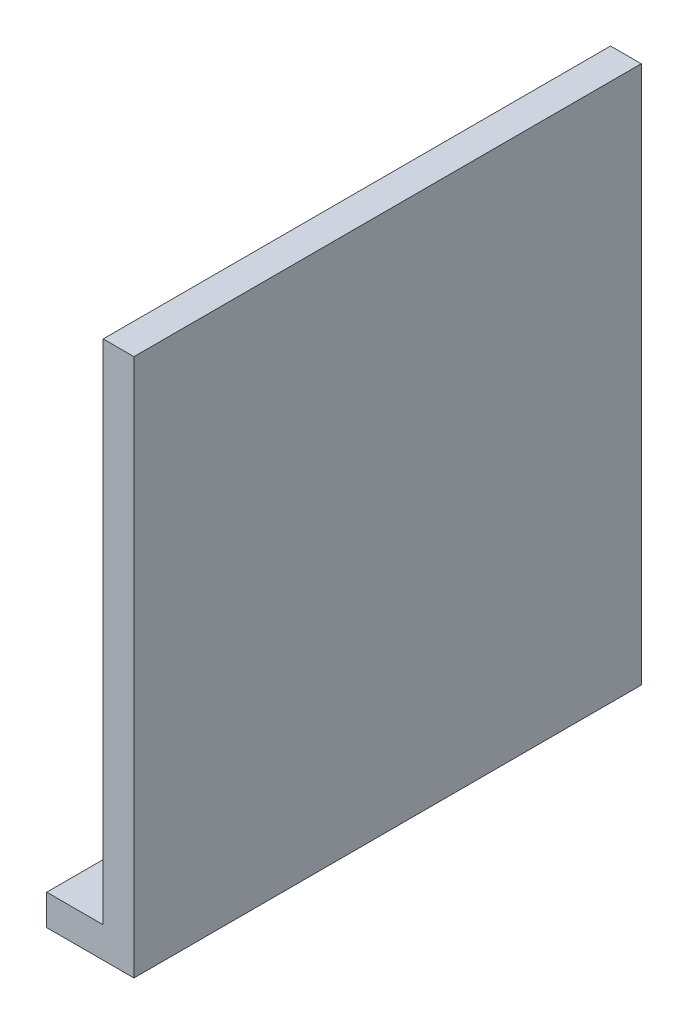
ISO-10303-21;
HEADER;
FILE_DESCRIPTION(('STEP AP214'),'2;1');
FILE_NAME('part.step','',(''),(''),'','','');
FILE_SCHEMA(('AUTOMOTIVE_DESIGN { 1 0 10303 214 1 1 1 1 }'));
ENDSEC;
DATA;
#1=APPLICATION_CONTEXT('core data for automotive mechanical design processes');
#2=APPLICATION_PROTOCOL_DEFINITION('international standard','automotive_design',2000,#1);
#3=PRODUCT_CONTEXT('',#1,'mechanical');
#4=PRODUCT('Part','Part','',(#3));
#5=PRODUCT_RELATED_PRODUCT_CATEGORY('part','',(#4));
#6=PRODUCT_DEFINITION_FORMATION('','',#4);
#7=PRODUCT_DEFINITION_CONTEXT('part definition',#1,'design');
#8=PRODUCT_DEFINITION('design','',#6,#7);
#9=PRODUCT_DEFINITION_SHAPE('','',#8);
#10=(LENGTH_UNIT() NAMED_UNIT(*) SI_UNIT(.MILLI.,.METRE.));
#11=(NAMED_UNIT(*) PLANE_ANGLE_UNIT() SI_UNIT($,.RADIAN.));
#12=(NAMED_UNIT(*) SI_UNIT($,.STERADIAN.) SOLID_ANGLE_UNIT());
#13=UNCERTAINTY_MEASURE_WITH_UNIT(LENGTH_MEASURE(1.E-05),#10,'distance_accuracy_value','');
#14=(GEOMETRIC_REPRESENTATION_CONTEXT(3) GLOBAL_UNCERTAINTY_ASSIGNED_CONTEXT((#13)) GLOBAL_UNIT_ASSIGNED_CONTEXT((#10,
#11,#12)) REPRESENTATION_CONTEXT('',''));
#15=CARTESIAN_POINT('',(0.,0.,0.));
#16=DIRECTION('',(0.,0.,1.));
#17=DIRECTION('',(1.,0.,0.));
#18=AXIS2_PLACEMENT_3D('',#15,#16,#17);
#19=CARTESIAN_POINT('',(0.,4.,0.));
#20=DIRECTION('',(0.,-1.,0.));
#21=DIRECTION('',(0.,0.,-1.));
#22=AXIS2_PLACEMENT_3D('',#19,#20,#21);
#23=PLANE('',#22);
#24=CARTESIAN_POINT('',(-7.90353715603886,4.,-25.4));
#25=DIRECTION('',(0.,1.,0.));
#26=DIRECTION('',(0.,0.,1.));
#27=AXIS2_PLACEMENT_3D('',#24,#25,#26);
#28=CIRCLE('',#27,2.1);
#29=CARTESIAN_POINT('',(-7.90353715603886,4.,-23.3));
#30=VERTEX_POINT('',#29);
#31=EDGE_CURVE('E265',#30,#30,#28,.T.);
#32=ORIENTED_EDGE('',*,*,#31,.F.);
#33=EDGE_LOOP('',(#32));
#34=FACE_BOUND('',#33,.T.);
#35=CARTESIAN_POINT('',(-7.90353715603886,4.,25.4));
#36=DIRECTION('',(0.,1.,0.));
#37=DIRECTION('',(0.,0.,1.));
#38=AXIS2_PLACEMENT_3D('',#35,#36,#37);
#39=CIRCLE('',#38,2.09999999999999);
#40=CARTESIAN_POINT('',(-7.90353715603886,4.,27.5));
#41=VERTEX_POINT('',#40);
#42=EDGE_CURVE('E274',#41,#41,#39,.T.);
#43=ORIENTED_EDGE('',*,*,#42,.F.);
#44=EDGE_LOOP('',(#43));
#45=FACE_BOUND('',#44,.T.);
#46=DIRECTION('',(0.,0.,1.));
#47=VECTOR('',#46,1.);
#48=CARTESIAN_POINT('',(-4.00000000000001,4.,-33.02));
#49=LINE('',#48,#47);
#50=CARTESIAN_POINT('',(-4.00000000000001,4.,-33.02));
#51=VERTEX_POINT('',#50);
#52=CARTESIAN_POINT('',(-4.00000000000001,4.,33.02));
#53=VERTEX_POINT('',#52);
#54=EDGE_CURVE('E57',#51,#53,#49,.T.);
#55=ORIENTED_EDGE('',*,*,#54,.F.);
#56=DIRECTION('',(-1.,0.,0.));
#57=VECTOR('',#56,1.);
#58=CARTESIAN_POINT('',(0.,4.,-33.02));
#59=LINE('',#58,#57);
#60=CARTESIAN_POINT('',(-11.35,4.,-33.02));
#61=VERTEX_POINT('',#60);
#62=EDGE_CURVE('E95',#51,#61,#59,.T.);
#63=ORIENTED_EDGE('',*,*,#62,.T.);
#64=DIRECTION('',(0.,0.,1.));
#65=VECTOR('',#64,1.);
#66=CARTESIAN_POINT('',(-11.35,4.,-33.02));
#67=LINE('',#66,#65);
#68=CARTESIAN_POINT('',(-11.35,4.,33.02));
#69=VERTEX_POINT('',#68);
#70=EDGE_CURVE('E63',#61,#69,#67,.T.);
#71=ORIENTED_EDGE('',*,*,#70,.T.);
#72=DIRECTION('',(1.,0.,0.));
#73=VECTOR('',#72,1.);
#74=CARTESIAN_POINT('',(0.,4.,33.02));
#75=LINE('',#74,#73);
#76=EDGE_CURVE('E106',#69,#53,#75,.T.);
#77=ORIENTED_EDGE('',*,*,#76,.T.);
#78=EDGE_LOOP('',(#55,#63,#71,#77));
#79=FACE_BOUND('',#78,.T.);
#80=ADVANCED_FACE('F41',(#34,#45,#79),#23,.F.);
#81=CARTESIAN_POINT('',(0.,4.,-33.02));
#82=DIRECTION('',(-1.,0.,0.));
#83=DIRECTION('',(0.,0.,1.));
#84=AXIS2_PLACEMENT_3D('',#81,#82,#83);
#85=PLANE('',#84);
#86=DIRECTION('',(0.,0.,-1.));
#87=VECTOR('',#86,1.);
#88=CARTESIAN_POINT('',(0.,0.,-33.02));
#89=LINE('',#88,#87);
#90=CARTESIAN_POINT('',(0.,0.,33.02));
#91=VERTEX_POINT('',#90);
#92=CARTESIAN_POINT('',(0.,0.,-33.02));
#93=VERTEX_POINT('',#92);
#94=EDGE_CURVE('E102',#91,#93,#89,.T.);
#95=ORIENTED_EDGE('',*,*,#94,.T.);
#96=DIRECTION('',(0.,-1.,0.));
#97=VECTOR('',#96,1.);
#98=CARTESIAN_POINT('',(0.,4.,-33.02));
#99=LINE('',#98,#97);
#100=CARTESIAN_POINT('',(0.,70.04,-33.02));
#101=VERTEX_POINT('',#100);
#102=EDGE_CURVE('E11',#101,#93,#99,.T.);
#103=ORIENTED_EDGE('',*,*,#102,.F.);
#104=DIRECTION('',(0.,0.,-1.));
#105=VECTOR('',#104,1.);
#106=CARTESIAN_POINT('',(0.,70.04,-33.02));
#107=LINE('',#106,#105);
#108=CARTESIAN_POINT('',(0.,70.04,33.02));
#109=VERTEX_POINT('',#108);
#110=EDGE_CURVE('E104',#109,#101,#107,.T.);
#111=ORIENTED_EDGE('',*,*,#110,.F.);
#112=DIRECTION('',(0.,-1.,0.));
#113=VECTOR('',#112,1.);
#114=CARTESIAN_POINT('',(0.,4.,33.02));
#115=LINE('',#114,#113);
#116=EDGE_CURVE('E87',#109,#91,#115,.T.);
#117=ORIENTED_EDGE('',*,*,#116,.T.);
#118=EDGE_LOOP('',(#95,#103,#111,#117));
#119=FACE_BOUND('',#118,.T.);
#120=ADVANCED_FACE('F43',(#119),#85,.F.);
#121=CARTESIAN_POINT('',(0.,4.,-33.02));
#122=DIRECTION('',(0.,0.,1.));
#123=DIRECTION('',(1.,0.,0.));
#124=AXIS2_PLACEMENT_3D('',#121,#122,#123);
#125=PLANE('',#124);
#126=DIRECTION('',(-1.,0.,0.));
#127=VECTOR('',#126,1.);
#128=CARTESIAN_POINT('',(0.,0.,-33.02));
#129=LINE('',#128,#127);
#130=CARTESIAN_POINT('',(-11.35,0.,-33.02));
#131=VERTEX_POINT('',#130);
#132=EDGE_CURVE('E109',#93,#131,#129,.T.);
#133=ORIENTED_EDGE('',*,*,#132,.T.);
#134=DIRECTION('',(0.,-1.,0.));
#135=VECTOR('',#134,1.);
#136=CARTESIAN_POINT('',(-11.35,4.,-33.02));
#137=LINE('',#136,#135);
#138=EDGE_CURVE('E50',#61,#131,#137,.T.);
#139=ORIENTED_EDGE('',*,*,#138,.F.);
#140=ORIENTED_EDGE('',*,*,#62,.F.);
#141=DIRECTION('',(0.,-1.,0.));
#142=VECTOR('',#141,1.);
#143=CARTESIAN_POINT('',(-4.00000000000001,70.04,-33.02));
#144=LINE('',#143,#142);
#145=CARTESIAN_POINT('',(-4.00000000000001,70.04,-33.02));
#146=VERTEX_POINT('',#145);
#147=EDGE_CURVE('E111',#146,#51,#144,.T.);
#148=ORIENTED_EDGE('',*,*,#147,.F.);
#149=DIRECTION('',(-1.,0.,0.));
#150=VECTOR('',#149,1.);
#151=CARTESIAN_POINT('',(0.,70.04,-33.02));
#152=LINE('',#151,#150);
#153=EDGE_CURVE('E136',#101,#146,#152,.T.);
#154=ORIENTED_EDGE('',*,*,#153,.F.);
#155=ORIENTED_EDGE('',*,*,#102,.T.);
#156=EDGE_LOOP('',(#133,#139,#140,#148,#154,#155));
#157=FACE_BOUND('',#156,.T.);
#158=ADVANCED_FACE('F131',(#157),#125,.F.);
#159=CARTESIAN_POINT('',(-11.35,4.,-33.02));
#160=DIRECTION('',(1.,0.,0.));
#161=DIRECTION('',(0.,0.,-1.));
#162=AXIS2_PLACEMENT_3D('',#159,#160,#161);
#163=PLANE('',#162);
#164=DIRECTION('',(0.,0.,1.));
#165=VECTOR('',#164,1.);
#166=CARTESIAN_POINT('',(-11.35,0.,-33.02));
#167=LINE('',#166,#165);
#168=CARTESIAN_POINT('',(-11.35,0.,33.02));
#169=VERTEX_POINT('',#168);
#170=EDGE_CURVE('E96',#131,#169,#167,.T.);
#171=ORIENTED_EDGE('',*,*,#170,.T.);
#172=DIRECTION('',(0.,-1.,0.));
#173=VECTOR('',#172,1.);
#174=CARTESIAN_POINT('',(-11.35,4.,33.02));
#175=LINE('',#174,#173);
#176=EDGE_CURVE('E90',#69,#169,#175,.T.);
#177=ORIENTED_EDGE('',*,*,#176,.F.);
#178=ORIENTED_EDGE('',*,*,#70,.F.);
#179=ORIENTED_EDGE('',*,*,#138,.T.);
#180=EDGE_LOOP('',(#171,#177,#178,#179));
#181=FACE_BOUND('',#180,.T.);
#182=ADVANCED_FACE('F129',(#181),#163,.F.);
#183=CARTESIAN_POINT('',(0.,4.,33.02));
#184=DIRECTION('',(0.,0.,-1.));
#185=DIRECTION('',(-1.,0.,0.));
#186=AXIS2_PLACEMENT_3D('',#183,#184,#185);
#187=PLANE('',#186);
#188=DIRECTION('',(1.,0.,0.));
#189=VECTOR('',#188,1.);
#190=CARTESIAN_POINT('',(0.,0.,33.02));
#191=LINE('',#190,#189);
#192=EDGE_CURVE('E83',#169,#91,#191,.T.);
#193=ORIENTED_EDGE('',*,*,#192,.T.);
#194=ORIENTED_EDGE('',*,*,#116,.F.);
#195=DIRECTION('',(1.,0.,0.));
#196=VECTOR('',#195,1.);
#197=CARTESIAN_POINT('',(0.,70.04,33.02));
#198=LINE('',#197,#196);
#199=CARTESIAN_POINT('',(-4.00000000000001,70.04,33.02));
#200=VERTEX_POINT('',#199);
#201=EDGE_CURVE('E150',#200,#109,#198,.T.);
#202=ORIENTED_EDGE('',*,*,#201,.F.);
#203=DIRECTION('',(0.,-1.,0.));
#204=VECTOR('',#203,1.);
#205=CARTESIAN_POINT('',(-4.00000000000001,70.04,33.02));
#206=LINE('',#205,#204);
#207=EDGE_CURVE('E117',#200,#53,#206,.T.);
#208=ORIENTED_EDGE('',*,*,#207,.T.);
#209=ORIENTED_EDGE('',*,*,#76,.F.);
#210=ORIENTED_EDGE('',*,*,#176,.T.);
#211=EDGE_LOOP('',(#193,#194,#202,#208,#209,#210));
#212=FACE_BOUND('',#211,.T.);
#213=ADVANCED_FACE('F85',(#212),#187,.F.);
#214=CARTESIAN_POINT('',(0.,0.,0.));
#215=DIRECTION('',(0.,-1.,0.));
#216=DIRECTION('',(0.,0.,-1.));
#217=AXIS2_PLACEMENT_3D('',#214,#215,#216);
#218=PLANE('',#217);
#219=CARTESIAN_POINT('',(-7.90353715603886,0.,-25.4));
#220=DIRECTION('',(0.,-1.,0.));
#221=DIRECTION('',(0.,0.,-1.));
#222=AXIS2_PLACEMENT_3D('',#219,#220,#221);
#223=CIRCLE('',#222,2.1);
#224=CARTESIAN_POINT('',(-7.90353715603886,0.,-27.5));
#225=VERTEX_POINT('',#224);
#226=EDGE_CURVE('E163',#225,#225,#223,.F.);
#227=ORIENTED_EDGE('',*,*,#226,.T.);
#228=EDGE_LOOP('',(#227));
#229=FACE_BOUND('',#228,.T.);
#230=CARTESIAN_POINT('',(-7.90353715603886,0.,25.4));
#231=DIRECTION('',(0.,-1.,0.));
#232=DIRECTION('',(0.,0.,-1.));
#233=AXIS2_PLACEMENT_3D('',#230,#231,#232);
#234=CIRCLE('',#233,2.09999999999999);
#235=CARTESIAN_POINT('',(-7.90353715603886,0.,23.3));
#236=VERTEX_POINT('',#235);
#237=EDGE_CURVE('E271',#236,#236,#234,.F.);
#238=ORIENTED_EDGE('',*,*,#237,.T.);
#239=EDGE_LOOP('',(#238));
#240=FACE_BOUND('',#239,.T.);
#241=ORIENTED_EDGE('',*,*,#94,.F.);
#242=ORIENTED_EDGE('',*,*,#192,.F.);
#243=ORIENTED_EDGE('',*,*,#170,.F.);
#244=ORIENTED_EDGE('',*,*,#132,.F.);
#245=EDGE_LOOP('',(#241,#242,#243,#244));
#246=FACE_BOUND('',#245,.T.);
#247=ADVANCED_FACE('F108',(#229,#240,#246),#218,.T.);
#248=CARTESIAN_POINT('',(-4.00000000000001,70.04,-33.02));
#249=DIRECTION('',(1.,0.,0.));
#250=DIRECTION('',(0.,0.,-1.));
#251=AXIS2_PLACEMENT_3D('',#248,#249,#250);
#252=PLANE('',#251);
#253=ORIENTED_EDGE('',*,*,#54,.T.);
#254=ORIENTED_EDGE('',*,*,#207,.F.);
#255=DIRECTION('',(0.,0.,1.));
#256=VECTOR('',#255,1.);
#257=CARTESIAN_POINT('',(-4.00000000000001,70.04,-33.02));
#258=LINE('',#257,#256);
#259=EDGE_CURVE('E147',#146,#200,#258,.T.);
#260=ORIENTED_EDGE('',*,*,#259,.F.);
#261=ORIENTED_EDGE('',*,*,#147,.T.);
#262=EDGE_LOOP('',(#253,#254,#260,#261));
#263=FACE_BOUND('',#262,.T.);
#264=ADVANCED_FACE('F155',(#263),#252,.F.);
#265=CARTESIAN_POINT('',(0.,70.04,0.));
#266=DIRECTION('',(0.,-1.,0.));
#267=DIRECTION('',(0.,0.,-1.));
#268=AXIS2_PLACEMENT_3D('',#265,#266,#267);
#269=PLANE('',#268);
#270=ORIENTED_EDGE('',*,*,#110,.T.);
#271=ORIENTED_EDGE('',*,*,#153,.T.);
#272=ORIENTED_EDGE('',*,*,#259,.T.);
#273=ORIENTED_EDGE('',*,*,#201,.T.);
#274=EDGE_LOOP('',(#270,#271,#272,#273));
#275=FACE_BOUND('',#274,.T.);
#276=ADVANCED_FACE('F149',(#275),#269,.F.);
#277=CARTESIAN_POINT('',(-7.90353715603886,-5.93969696196699,25.4));
#278=DIRECTION('',(0.,1.,0.));
#279=DIRECTION('',(0.,0.,1.));
#280=AXIS2_PLACEMENT_3D('',#277,#278,#279);
#281=CYLINDRICAL_SURFACE('',#280,2.09999999999999);
#282=ORIENTED_EDGE('',*,*,#42,.T.);
#283=EDGE_LOOP('',(#282));
#284=FACE_BOUND('',#283,.T.);
#285=ORIENTED_EDGE('',*,*,#237,.F.);
#286=EDGE_LOOP('',(#285));
#287=FACE_BOUND('',#286,.T.);
#288=ADVANCED_FACE('F214',(#284,#287),#281,.F.);
#289=CARTESIAN_POINT('',(-7.90353715603886,-5.93969696196699,-25.4));
#290=DIRECTION('',(0.,1.,0.));
#291=DIRECTION('',(0.,0.,1.));
#292=AXIS2_PLACEMENT_3D('',#289,#290,#291);
#293=CYLINDRICAL_SURFACE('',#292,2.1);
#294=ORIENTED_EDGE('',*,*,#31,.T.);
#295=EDGE_LOOP('',(#294));
#296=FACE_BOUND('',#295,.T.);
#297=ORIENTED_EDGE('',*,*,#226,.F.);
#298=EDGE_LOOP('',(#297));
#299=FACE_BOUND('',#298,.T.);
#300=ADVANCED_FACE('F219',(#296,#299),#293,.F.);
#301=CLOSED_SHELL('',(#80,#120,#158,#182,#213,#247,#264,#276,#288,#300));
#302=MANIFOLD_SOLID_BREP('B2',#301);
#303=ADVANCED_BREP_SHAPE_REPRESENTATION('',(#18,#302),#14);
#304=SHAPE_DEFINITION_REPRESENTATION(#9,#303);
ENDSEC;
END-ISO-10303-21;
